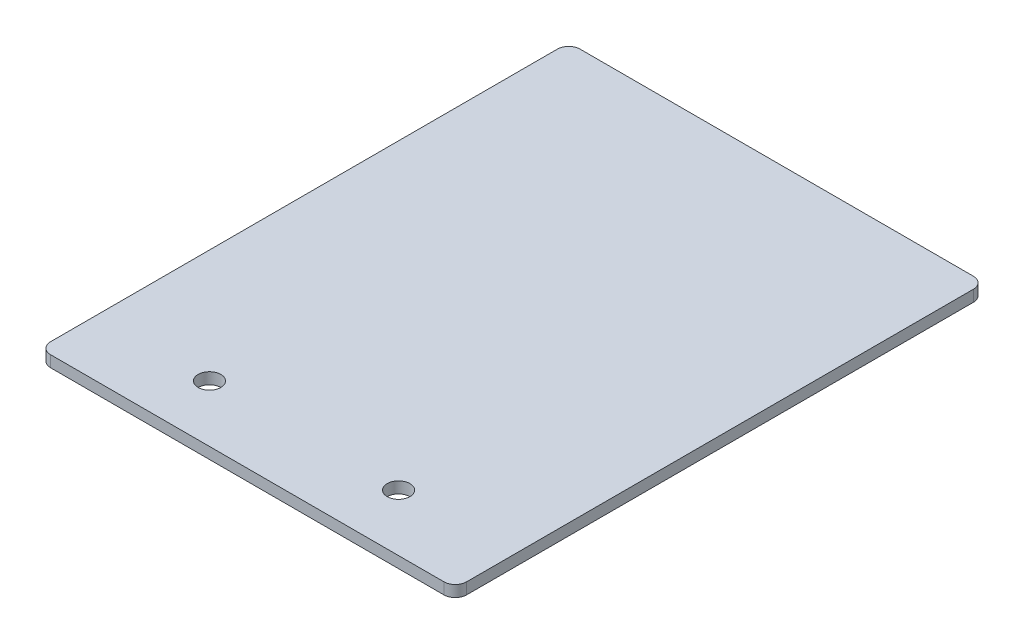
ISO-10303-21;
HEADER;
FILE_DESCRIPTION(('STEP AP214'),'2;1');
FILE_NAME('part.step','',(''),(''),'','','');
FILE_SCHEMA(('AUTOMOTIVE_DESIGN { 1 0 10303 214 1 1 1 1 }'));
ENDSEC;
DATA;
#1=APPLICATION_CONTEXT('core data for automotive mechanical design processes');
#2=APPLICATION_PROTOCOL_DEFINITION('international standard','automotive_design',2000,#1);
#3=PRODUCT_CONTEXT('',#1,'mechanical');
#4=PRODUCT('Part','Part','',(#3));
#5=PRODUCT_RELATED_PRODUCT_CATEGORY('part','',(#4));
#6=PRODUCT_DEFINITION_FORMATION('','',#4);
#7=PRODUCT_DEFINITION_CONTEXT('part definition',#1,'design');
#8=PRODUCT_DEFINITION('design','',#6,#7);
#9=PRODUCT_DEFINITION_SHAPE('','',#8);
#10=(LENGTH_UNIT() NAMED_UNIT(*) SI_UNIT(.MILLI.,.METRE.));
#11=(NAMED_UNIT(*) PLANE_ANGLE_UNIT() SI_UNIT($,.RADIAN.));
#12=(NAMED_UNIT(*) SI_UNIT($,.STERADIAN.) SOLID_ANGLE_UNIT());
#13=UNCERTAINTY_MEASURE_WITH_UNIT(LENGTH_MEASURE(1.E-05),#10,'distance_accuracy_value','');
#14=(GEOMETRIC_REPRESENTATION_CONTEXT(3) GLOBAL_UNCERTAINTY_ASSIGNED_CONTEXT((#13)) GLOBAL_UNIT_ASSIGNED_CONTEXT((#10,
#11,#12)) REPRESENTATION_CONTEXT('',''));
#15=CARTESIAN_POINT('',(0.,0.,0.));
#16=DIRECTION('',(0.,0.,1.));
#17=DIRECTION('',(1.,0.,0.));
#18=AXIS2_PLACEMENT_3D('',#15,#16,#17);
#19=CARTESIAN_POINT('',(55.,3.,-70.));
#20=DIRECTION('',(-1.,0.,0.));
#21=DIRECTION('',(0.,0.,1.));
#22=AXIS2_PLACEMENT_3D('',#19,#20,#21);
#23=PLANE('',#22);
#24=DIRECTION('',(0.,0.,-1.));
#25=VECTOR('',#24,1.);
#26=CARTESIAN_POINT('',(55.,0.,-70.));
#27=LINE('',#26,#25);
#28=CARTESIAN_POINT('',(55.,0.,67.));
#29=VERTEX_POINT('',#28);
#30=CARTESIAN_POINT('',(55.,0.,-67.));
#31=VERTEX_POINT('',#30);
#32=EDGE_CURVE('E130',#29,#31,#27,.T.);
#33=ORIENTED_EDGE('',*,*,#32,.T.);
#34=DIRECTION('',(0.,-1.,0.));
#35=VECTOR('',#34,1.);
#36=CARTESIAN_POINT('',(55.,3.,-67.));
#37=LINE('',#36,#35);
#38=CARTESIAN_POINT('',(55.,3.,-67.));
#39=VERTEX_POINT('',#38);
#40=EDGE_CURVE('E153',#31,#39,#37,.F.);
#41=ORIENTED_EDGE('',*,*,#40,.T.);
#42=DIRECTION('',(0.,0.,-1.));
#43=VECTOR('',#42,1.);
#44=CARTESIAN_POINT('',(55.,3.,-70.));
#45=LINE('',#44,#43);
#46=CARTESIAN_POINT('',(55.,3.,67.));
#47=VERTEX_POINT('',#46);
#48=EDGE_CURVE('E128',#47,#39,#45,.T.);
#49=ORIENTED_EDGE('',*,*,#48,.F.);
#50=DIRECTION('',(0.,-1.,0.));
#51=VECTOR('',#50,1.);
#52=CARTESIAN_POINT('',(55.,3.,67.));
#53=LINE('',#52,#51);
#54=EDGE_CURVE('E150',#47,#29,#53,.T.);
#55=ORIENTED_EDGE('',*,*,#54,.T.);
#56=EDGE_LOOP('',(#33,#41,#49,#55));
#57=FACE_BOUND('',#56,.T.);
#58=ADVANCED_FACE('F35',(#57),#23,.F.);
#59=CARTESIAN_POINT('',(-55.,3.,-70.));
#60=DIRECTION('',(0.,0.,1.));
#61=DIRECTION('',(1.,0.,0.));
#62=AXIS2_PLACEMENT_3D('',#59,#60,#61);
#63=PLANE('',#62);
#64=DIRECTION('',(-1.,0.,0.));
#65=VECTOR('',#64,1.);
#66=CARTESIAN_POINT('',(-55.,0.,-70.));
#67=LINE('',#66,#65);
#68=CARTESIAN_POINT('',(52.,0.,-70.));
#69=VERTEX_POINT('',#68);
#70=CARTESIAN_POINT('',(-52.,0.,-70.));
#71=VERTEX_POINT('',#70);
#72=EDGE_CURVE('E126',#69,#71,#67,.T.);
#73=ORIENTED_EDGE('',*,*,#72,.T.);
#74=DIRECTION('',(0.,-1.,0.));
#75=VECTOR('',#74,1.);
#76=CARTESIAN_POINT('',(-52.,3.,-70.));
#77=LINE('',#76,#75);
#78=CARTESIAN_POINT('',(-52.,3.,-70.));
#79=VERTEX_POINT('',#78);
#80=EDGE_CURVE('E105',#71,#79,#77,.F.);
#81=ORIENTED_EDGE('',*,*,#80,.T.);
#82=DIRECTION('',(-1.,0.,0.));
#83=VECTOR('',#82,1.);
#84=CARTESIAN_POINT('',(-55.,3.,-70.));
#85=LINE('',#84,#83);
#86=CARTESIAN_POINT('',(52.,3.,-70.));
#87=VERTEX_POINT('',#86);
#88=EDGE_CURVE('E169',#87,#79,#85,.T.);
#89=ORIENTED_EDGE('',*,*,#88,.F.);
#90=DIRECTION('',(0.,-1.,0.));
#91=VECTOR('',#90,1.);
#92=CARTESIAN_POINT('',(52.,3.,-70.));
#93=LINE('',#92,#91);
#94=EDGE_CURVE('E110',#87,#69,#93,.T.);
#95=ORIENTED_EDGE('',*,*,#94,.T.);
#96=EDGE_LOOP('',(#73,#81,#89,#95));
#97=FACE_BOUND('',#96,.T.);
#98=ADVANCED_FACE('F213',(#97),#63,.F.);
#99=CARTESIAN_POINT('',(-55.,3.,-70.));
#100=DIRECTION('',(1.,0.,0.));
#101=DIRECTION('',(0.,0.,-1.));
#102=AXIS2_PLACEMENT_3D('',#99,#100,#101);
#103=PLANE('',#102);
#104=DIRECTION('',(0.,0.,1.));
#105=VECTOR('',#104,1.);
#106=CARTESIAN_POINT('',(-55.,3.,-70.));
#107=LINE('',#106,#105);
#108=CARTESIAN_POINT('',(-55.,3.,-67.));
#109=VERTEX_POINT('',#108);
#110=CARTESIAN_POINT('',(-55.,3.,67.));
#111=VERTEX_POINT('',#110);
#112=EDGE_CURVE('E119',#109,#111,#107,.T.);
#113=ORIENTED_EDGE('',*,*,#112,.F.);
#114=DIRECTION('',(0.,-1.,0.));
#115=VECTOR('',#114,1.);
#116=CARTESIAN_POINT('',(-55.,3.,-67.));
#117=LINE('',#116,#115);
#118=CARTESIAN_POINT('',(-55.,0.,-67.));
#119=VERTEX_POINT('',#118);
#120=EDGE_CURVE('E104',#109,#119,#117,.T.);
#121=ORIENTED_EDGE('',*,*,#120,.T.);
#122=DIRECTION('',(0.,0.,1.));
#123=VECTOR('',#122,1.);
#124=CARTESIAN_POINT('',(-55.,0.,-70.));
#125=LINE('',#124,#123);
#126=CARTESIAN_POINT('',(-55.,0.,67.));
#127=VERTEX_POINT('',#126);
#128=EDGE_CURVE('E117',#119,#127,#125,.T.);
#129=ORIENTED_EDGE('',*,*,#128,.T.);
#130=DIRECTION('',(0.,-1.,0.));
#131=VECTOR('',#130,1.);
#132=CARTESIAN_POINT('',(-55.,3.,67.));
#133=LINE('',#132,#131);
#134=EDGE_CURVE('E121',#127,#111,#133,.F.);
#135=ORIENTED_EDGE('',*,*,#134,.T.);
#136=EDGE_LOOP('',(#113,#121,#129,#135));
#137=FACE_BOUND('',#136,.T.);
#138=ADVANCED_FACE('F116',(#137),#103,.F.);
#139=CARTESIAN_POINT('',(-55.,3.,70.));
#140=DIRECTION('',(0.,0.,-1.));
#141=DIRECTION('',(-1.,0.,0.));
#142=AXIS2_PLACEMENT_3D('',#139,#140,#141);
#143=PLANE('',#142);
#144=DIRECTION('',(1.,0.,0.));
#145=VECTOR('',#144,1.);
#146=CARTESIAN_POINT('',(-55.,0.,70.));
#147=LINE('',#146,#145);
#148=CARTESIAN_POINT('',(-52.,0.,70.));
#149=VERTEX_POINT('',#148);
#150=CARTESIAN_POINT('',(52.,0.,70.));
#151=VERTEX_POINT('',#150);
#152=EDGE_CURVE('E125',#149,#151,#147,.T.);
#153=ORIENTED_EDGE('',*,*,#152,.T.);
#154=DIRECTION('',(0.,-1.,0.));
#155=VECTOR('',#154,1.);
#156=CARTESIAN_POINT('',(52.,3.,70.));
#157=LINE('',#156,#155);
#158=CARTESIAN_POINT('',(52.,3.,70.));
#159=VERTEX_POINT('',#158);
#160=EDGE_CURVE('E11',#151,#159,#157,.F.);
#161=ORIENTED_EDGE('',*,*,#160,.T.);
#162=DIRECTION('',(1.,0.,0.));
#163=VECTOR('',#162,1.);
#164=CARTESIAN_POINT('',(-55.,3.,70.));
#165=LINE('',#164,#163);
#166=CARTESIAN_POINT('',(-52.,3.,70.));
#167=VERTEX_POINT('',#166);
#168=EDGE_CURVE('E134',#167,#159,#165,.T.);
#169=ORIENTED_EDGE('',*,*,#168,.F.);
#170=DIRECTION('',(0.,-1.,0.));
#171=VECTOR('',#170,1.);
#172=CARTESIAN_POINT('',(-52.,3.,70.));
#173=LINE('',#172,#171);
#174=EDGE_CURVE('E43',#167,#149,#173,.T.);
#175=ORIENTED_EDGE('',*,*,#174,.T.);
#176=EDGE_LOOP('',(#153,#161,#169,#175));
#177=FACE_BOUND('',#176,.T.);
#178=ADVANCED_FACE('F156',(#177),#143,.F.);
#179=CARTESIAN_POINT('',(0.,3.,0.));
#180=DIRECTION('',(0.,1.,0.));
#181=DIRECTION('',(0.,0.,1.));
#182=AXIS2_PLACEMENT_3D('',#179,#180,#181);
#183=PLANE('',#182);
#184=CARTESIAN_POINT('',(25.,3.,55.));
#185=DIRECTION('',(0.,-1.,0.));
#186=DIRECTION('',(0.,0.,1.));
#187=AXIS2_PLACEMENT_3D('',#184,#185,#186);
#188=CIRCLE('',#187,3.);
#189=CARTESIAN_POINT('',(25.,3.,58.));
#190=VERTEX_POINT('',#189);
#191=EDGE_CURVE('E183',#190,#190,#188,.T.);
#192=ORIENTED_EDGE('',*,*,#191,.T.);
#193=EDGE_LOOP('',(#192));
#194=FACE_BOUND('',#193,.T.);
#195=CARTESIAN_POINT('',(-25.,3.,55.));
#196=DIRECTION('',(0.,-1.,0.));
#197=DIRECTION('',(0.,0.,-1.));
#198=AXIS2_PLACEMENT_3D('',#195,#196,#197);
#199=CIRCLE('',#198,3.);
#200=CARTESIAN_POINT('',(-25.,3.,52.));
#201=VERTEX_POINT('',#200);
#202=EDGE_CURVE('E178',#201,#201,#199,.T.);
#203=ORIENTED_EDGE('',*,*,#202,.T.);
#204=EDGE_LOOP('',(#203));
#205=FACE_BOUND('',#204,.T.);
#206=ORIENTED_EDGE('',*,*,#88,.T.);
#207=CARTESIAN_POINT('',(-52.,3.,-67.));
#208=DIRECTION('',(0.,1.,0.));
#209=DIRECTION('',(0.,0.,1.));
#210=AXIS2_PLACEMENT_3D('',#207,#208,#209);
#211=CIRCLE('',#210,3.);
#212=EDGE_CURVE('E148',#79,#109,#211,.T.);
#213=ORIENTED_EDGE('',*,*,#212,.T.);
#214=ORIENTED_EDGE('',*,*,#112,.T.);
#215=CARTESIAN_POINT('',(-52.,3.,67.));
#216=DIRECTION('',(0.,1.,0.));
#217=DIRECTION('',(0.,0.,1.));
#218=AXIS2_PLACEMENT_3D('',#215,#216,#217);
#219=CIRCLE('',#218,3.);
#220=EDGE_CURVE('E55',#111,#167,#219,.T.);
#221=ORIENTED_EDGE('',*,*,#220,.T.);
#222=ORIENTED_EDGE('',*,*,#168,.T.);
#223=CARTESIAN_POINT('',(52.,3.,67.));
#224=DIRECTION('',(0.,1.,0.));
#225=DIRECTION('',(0.,0.,1.));
#226=AXIS2_PLACEMENT_3D('',#223,#224,#225);
#227=CIRCLE('',#226,3.);
#228=EDGE_CURVE('E144',#159,#47,#227,.T.);
#229=ORIENTED_EDGE('',*,*,#228,.T.);
#230=ORIENTED_EDGE('',*,*,#48,.T.);
#231=CARTESIAN_POINT('',(52.,3.,-67.));
#232=DIRECTION('',(0.,1.,0.));
#233=DIRECTION('',(0.,0.,1.));
#234=AXIS2_PLACEMENT_3D('',#231,#232,#233);
#235=CIRCLE('',#234,3.);
#236=EDGE_CURVE('E146',#39,#87,#235,.T.);
#237=ORIENTED_EDGE('',*,*,#236,.T.);
#238=EDGE_LOOP('',(#206,#213,#214,#221,#222,#229,#230,#237));
#239=FACE_BOUND('',#238,.T.);
#240=ADVANCED_FACE('F191',(#194,#205,#239),#183,.T.);
#241=CARTESIAN_POINT('',(0.,0.,0.));
#242=DIRECTION('',(0.,1.,0.));
#243=DIRECTION('',(0.,0.,1.));
#244=AXIS2_PLACEMENT_3D('',#241,#242,#243);
#245=PLANE('',#244);
#246=CARTESIAN_POINT('',(25.,0.,55.));
#247=DIRECTION('',(0.,-1.,0.));
#248=DIRECTION('',(0.,0.,1.));
#249=AXIS2_PLACEMENT_3D('',#246,#247,#248);
#250=CIRCLE('',#249,3.);
#251=CARTESIAN_POINT('',(25.,0.,58.));
#252=VERTEX_POINT('',#251);
#253=EDGE_CURVE('E185',#252,#252,#250,.T.);
#254=ORIENTED_EDGE('',*,*,#253,.F.);
#255=EDGE_LOOP('',(#254));
#256=FACE_BOUND('',#255,.T.);
#257=CARTESIAN_POINT('',(-25.,0.,55.));
#258=DIRECTION('',(0.,-1.,0.));
#259=DIRECTION('',(0.,0.,-1.));
#260=AXIS2_PLACEMENT_3D('',#257,#258,#259);
#261=CIRCLE('',#260,3.);
#262=CARTESIAN_POINT('',(-25.,0.,52.));
#263=VERTEX_POINT('',#262);
#264=EDGE_CURVE('E174',#263,#263,#261,.T.);
#265=ORIENTED_EDGE('',*,*,#264,.F.);
#266=EDGE_LOOP('',(#265));
#267=FACE_BOUND('',#266,.T.);
#268=ORIENTED_EDGE('',*,*,#128,.F.);
#269=CARTESIAN_POINT('',(-52.,0.,-67.));
#270=DIRECTION('',(0.,1.,0.));
#271=DIRECTION('',(0.,0.,1.));
#272=AXIS2_PLACEMENT_3D('',#269,#270,#271);
#273=CIRCLE('',#272,3.);
#274=EDGE_CURVE('E100',#119,#71,#273,.F.);
#275=ORIENTED_EDGE('',*,*,#274,.T.);
#276=ORIENTED_EDGE('',*,*,#72,.F.);
#277=CARTESIAN_POINT('',(52.,0.,-67.));
#278=DIRECTION('',(0.,1.,0.));
#279=DIRECTION('',(0.,0.,1.));
#280=AXIS2_PLACEMENT_3D('',#277,#278,#279);
#281=CIRCLE('',#280,3.);
#282=EDGE_CURVE('E111',#69,#31,#281,.F.);
#283=ORIENTED_EDGE('',*,*,#282,.T.);
#284=ORIENTED_EDGE('',*,*,#32,.F.);
#285=CARTESIAN_POINT('',(52.,0.,67.));
#286=DIRECTION('',(0.,1.,0.));
#287=DIRECTION('',(0.,0.,1.));
#288=AXIS2_PLACEMENT_3D('',#285,#286,#287);
#289=CIRCLE('',#288,3.);
#290=EDGE_CURVE('E137',#29,#151,#289,.F.);
#291=ORIENTED_EDGE('',*,*,#290,.T.);
#292=ORIENTED_EDGE('',*,*,#152,.F.);
#293=CARTESIAN_POINT('',(-52.,0.,67.));
#294=DIRECTION('',(0.,1.,0.));
#295=DIRECTION('',(0.,0.,1.));
#296=AXIS2_PLACEMENT_3D('',#293,#294,#295);
#297=CIRCLE('',#296,3.);
#298=EDGE_CURVE('E120',#149,#127,#297,.F.);
#299=ORIENTED_EDGE('',*,*,#298,.T.);
#300=EDGE_LOOP('',(#268,#275,#276,#283,#284,#291,#292,#299));
#301=FACE_BOUND('',#300,.T.);
#302=ADVANCED_FACE('F123',(#256,#267,#301),#245,.F.);
#303=CARTESIAN_POINT('',(-25.,3.,55.));
#304=DIRECTION('',(0.,-1.,0.));
#305=DIRECTION('',(0.,0.,-1.));
#306=AXIS2_PLACEMENT_3D('',#303,#304,#305);
#307=CYLINDRICAL_SURFACE('',#306,3.);
#308=ORIENTED_EDGE('',*,*,#202,.F.);
#309=EDGE_LOOP('',(#308));
#310=FACE_BOUND('',#309,.T.);
#311=ORIENTED_EDGE('',*,*,#264,.T.);
#312=EDGE_LOOP('',(#311));
#313=FACE_BOUND('',#312,.T.);
#314=ADVANCED_FACE('F196',(#310,#313),#307,.F.);
#315=CARTESIAN_POINT('',(25.,3.,55.));
#316=DIRECTION('',(0.,-1.,0.));
#317=DIRECTION('',(0.,0.,-1.));
#318=AXIS2_PLACEMENT_3D('',#315,#316,#317);
#319=CYLINDRICAL_SURFACE('',#318,3.);
#320=ORIENTED_EDGE('',*,*,#191,.F.);
#321=EDGE_LOOP('',(#320));
#322=FACE_BOUND('',#321,.T.);
#323=ORIENTED_EDGE('',*,*,#253,.T.);
#324=EDGE_LOOP('',(#323));
#325=FACE_BOUND('',#324,.T.);
#326=ADVANCED_FACE('F193',(#322,#325),#319,.F.);
#327=CARTESIAN_POINT('',(-52.,3.,-67.));
#328=DIRECTION('',(0.,-1.,0.));
#329=DIRECTION('',(0.,0.,-1.));
#330=AXIS2_PLACEMENT_3D('',#327,#328,#329);
#331=CYLINDRICAL_SURFACE('',#330,3.);
#332=ORIENTED_EDGE('',*,*,#212,.F.);
#333=ORIENTED_EDGE('',*,*,#80,.F.);
#334=ORIENTED_EDGE('',*,*,#274,.F.);
#335=ORIENTED_EDGE('',*,*,#120,.F.);
#336=EDGE_LOOP('',(#332,#333,#334,#335));
#337=FACE_BOUND('',#336,.T.);
#338=ADVANCED_FACE('F103',(#337),#331,.T.);
#339=CARTESIAN_POINT('',(52.,3.,-67.));
#340=DIRECTION('',(0.,-1.,0.));
#341=DIRECTION('',(0.,0.,-1.));
#342=AXIS2_PLACEMENT_3D('',#339,#340,#341);
#343=CYLINDRICAL_SURFACE('',#342,3.);
#344=ORIENTED_EDGE('',*,*,#236,.F.);
#345=ORIENTED_EDGE('',*,*,#40,.F.);
#346=ORIENTED_EDGE('',*,*,#282,.F.);
#347=ORIENTED_EDGE('',*,*,#94,.F.);
#348=EDGE_LOOP('',(#344,#345,#346,#347));
#349=FACE_BOUND('',#348,.T.);
#350=ADVANCED_FACE('F225',(#349),#343,.T.);
#351=CARTESIAN_POINT('',(52.,3.,67.));
#352=DIRECTION('',(0.,-1.,0.));
#353=DIRECTION('',(0.,0.,-1.));
#354=AXIS2_PLACEMENT_3D('',#351,#352,#353);
#355=CYLINDRICAL_SURFACE('',#354,3.);
#356=ORIENTED_EDGE('',*,*,#228,.F.);
#357=ORIENTED_EDGE('',*,*,#160,.F.);
#358=ORIENTED_EDGE('',*,*,#290,.F.);
#359=ORIENTED_EDGE('',*,*,#54,.F.);
#360=EDGE_LOOP('',(#356,#357,#358,#359));
#361=FACE_BOUND('',#360,.T.);
#362=ADVANCED_FACE('F163',(#361),#355,.T.);
#363=CARTESIAN_POINT('',(-52.,3.,67.));
#364=DIRECTION('',(0.,-1.,0.));
#365=DIRECTION('',(0.,0.,-1.));
#366=AXIS2_PLACEMENT_3D('',#363,#364,#365);
#367=CYLINDRICAL_SURFACE('',#366,3.);
#368=ORIENTED_EDGE('',*,*,#220,.F.);
#369=ORIENTED_EDGE('',*,*,#134,.F.);
#370=ORIENTED_EDGE('',*,*,#298,.F.);
#371=ORIENTED_EDGE('',*,*,#174,.F.);
#372=EDGE_LOOP('',(#368,#369,#370,#371));
#373=FACE_BOUND('',#372,.T.);
#374=ADVANCED_FACE('F37',(#373),#367,.T.);
#375=CLOSED_SHELL('',(#58,#98,#138,#178,#240,#302,#314,#326,#338,#350,#362,#374));
#376=MANIFOLD_SOLID_BREP('B2',#375);
#377=ADVANCED_BREP_SHAPE_REPRESENTATION('',(#18,#376),#14);
#378=SHAPE_DEFINITION_REPRESENTATION(#9,#377);
ENDSEC;
END-ISO-10303-21;
